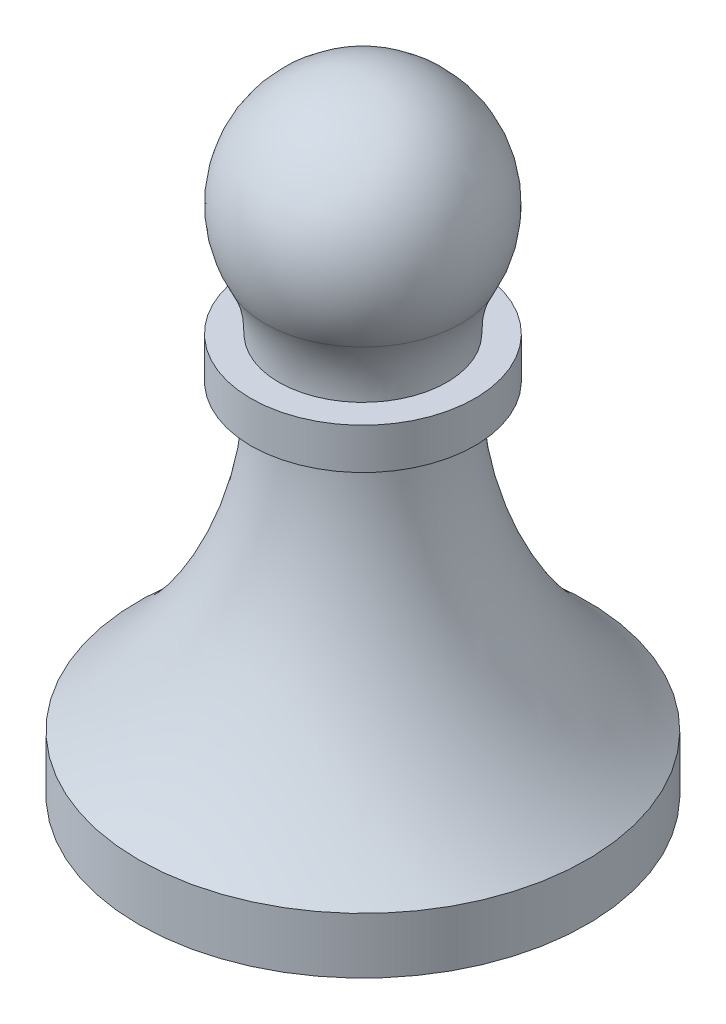
ISO-10303-21;
HEADER;
FILE_DESCRIPTION(('STEP AP214'),'2;1');
FILE_NAME('part.step','',(''),(''),'','','');
FILE_SCHEMA(('AUTOMOTIVE_DESIGN { 1 0 10303 214 1 1 1 1 }'));
ENDSEC;
DATA;
#1=APPLICATION_CONTEXT('core data for automotive mechanical design processes');
#2=APPLICATION_PROTOCOL_DEFINITION('international standard','automotive_design',2000,#1);
#3=PRODUCT_CONTEXT('',#1,'mechanical');
#4=PRODUCT('Part','Part','',(#3));
#5=PRODUCT_RELATED_PRODUCT_CATEGORY('part','',(#4));
#6=PRODUCT_DEFINITION_FORMATION('','',#4);
#7=PRODUCT_DEFINITION_CONTEXT('part definition',#1,'design');
#8=PRODUCT_DEFINITION('design','',#6,#7);
#9=PRODUCT_DEFINITION_SHAPE('','',#8);
#10=(LENGTH_UNIT() NAMED_UNIT(*) SI_UNIT(.MILLI.,.METRE.));
#11=(NAMED_UNIT(*) PLANE_ANGLE_UNIT() SI_UNIT($,.RADIAN.));
#12=(NAMED_UNIT(*) SI_UNIT($,.STERADIAN.) SOLID_ANGLE_UNIT());
#13=UNCERTAINTY_MEASURE_WITH_UNIT(LENGTH_MEASURE(1.E-05),#10,'distance_accuracy_value','');
#14=(GEOMETRIC_REPRESENTATION_CONTEXT(3) GLOBAL_UNCERTAINTY_ASSIGNED_CONTEXT((#13)) GLOBAL_UNIT_ASSIGNED_CONTEXT((#10,
#11,#12)) REPRESENTATION_CONTEXT('',''));
#15=CARTESIAN_POINT('',(0.,0.,0.));
#16=DIRECTION('',(0.,0.,1.));
#17=DIRECTION('',(1.,0.,0.));
#18=AXIS2_PLACEMENT_3D('',#15,#16,#17);
#19=CARTESIAN_POINT('',(0.,21.8150581838445,0.));
#20=DIRECTION('',(0.,1.,0.));
#21=DIRECTION('',(0.,0.,1.));
#22=AXIS2_PLACEMENT_3D('',#19,#20,#21);
#23=CYLINDRICAL_SURFACE('',#22,12.);
#24=CARTESIAN_POINT('',(0.,-19.2,0.));
#25=DIRECTION('',(0.,1.,0.));
#26=DIRECTION('',(0.,0.,1.));
#27=AXIS2_PLACEMENT_3D('',#24,#25,#26);
#28=CIRCLE('',#27,12.);
#29=CARTESIAN_POINT('',(0.,-19.2,12.));
#30=VERTEX_POINT('',#29);
#31=EDGE_CURVE('E63',#30,#30,#28,.T.);
#32=ORIENTED_EDGE('',*,*,#31,.T.);
#33=EDGE_LOOP('',(#32));
#34=FACE_BOUND('',#33,.T.);
#35=CARTESIAN_POINT('',(0.,-16.2,0.));
#36=DIRECTION('',(0.,1.,0.));
#37=DIRECTION('',(0.,0.,1.));
#38=AXIS2_PLACEMENT_3D('',#35,#36,#37);
#39=CIRCLE('',#38,12.);
#40=CARTESIAN_POINT('',(0.,-16.2,12.));
#41=VERTEX_POINT('',#40);
#42=EDGE_CURVE('E10',#41,#41,#39,.T.);
#43=ORIENTED_EDGE('',*,*,#42,.F.);
#44=EDGE_LOOP('',(#43));
#45=FACE_BOUND('',#44,.T.);
#46=ADVANCED_FACE('F38',(#34,#45),#23,.T.);
#47=CARTESIAN_POINT('',(0.,-0.114032224913734,0.));
#48=DIRECTION('',(0.,1.,0.));
#49=DIRECTION('',(0.,0.,1.));
#50=AXIS2_PLACEMENT_3D('',#47,#48,#49);
#51=TOROIDAL_SURFACE('',#50,25.4996903941863,21.);
#52=CARTESIAN_POINT('',(0.,0.,0.));
#53=DIRECTION('',(0.,1.,0.));
#54=DIRECTION('',(0.,0.,1.));
#55=AXIS2_PLACEMENT_3D('',#52,#53,#54);
#56=CIRCLE('',#55,4.5);
#57=CARTESIAN_POINT('',(0.,0.,4.5));
#58=VERTEX_POINT('',#57);
#59=EDGE_CURVE('E44',#58,#58,#56,.T.);
#60=ORIENTED_EDGE('',*,*,#59,.F.);
#61=EDGE_LOOP('',(#60));
#62=FACE_BOUND('',#61,.T.);
#63=ORIENTED_EDGE('',*,*,#42,.T.);
#64=EDGE_LOOP('',(#63));
#65=FACE_BOUND('',#64,.T.);
#66=ADVANCED_FACE('F80',(#62,#65),#51,.F.);
#67=CARTESIAN_POINT('',(0.,0.,0.));
#68=DIRECTION('',(0.,1.,0.));
#69=DIRECTION('',(0.,0.,1.));
#70=AXIS2_PLACEMENT_3D('',#67,#68,#69);
#71=PLANE('',#70);
#72=CARTESIAN_POINT('',(0.,0.,0.));
#73=DIRECTION('',(0.,1.,0.));
#74=DIRECTION('',(0.,0.,1.));
#75=AXIS2_PLACEMENT_3D('',#72,#73,#74);
#76=CIRCLE('',#75,6.);
#77=CARTESIAN_POINT('',(0.,0.,6.));
#78=VERTEX_POINT('',#77);
#79=EDGE_CURVE('E48',#78,#78,#76,.T.);
#80=ORIENTED_EDGE('',*,*,#79,.F.);
#81=EDGE_LOOP('',(#80));
#82=FACE_BOUND('',#81,.T.);
#83=ORIENTED_EDGE('',*,*,#59,.T.);
#84=EDGE_LOOP('',(#83));
#85=FACE_BOUND('',#84,.T.);
#86=ADVANCED_FACE('F84',(#82,#85),#71,.F.);
#87=CARTESIAN_POINT('',(0.,21.8150581838445,0.));
#88=DIRECTION('',(0.,1.,0.));
#89=DIRECTION('',(0.,0.,1.));
#90=AXIS2_PLACEMENT_3D('',#87,#88,#89);
#91=CYLINDRICAL_SURFACE('',#90,6.);
#92=CARTESIAN_POINT('',(0.,2.19483372139822,0.));
#93=DIRECTION('',(0.,1.,0.));
#94=DIRECTION('',(0.,0.,1.));
#95=AXIS2_PLACEMENT_3D('',#92,#93,#94);
#96=CIRCLE('',#95,6.);
#97=CARTESIAN_POINT('',(0.,2.19483372139822,6.));
#98=VERTEX_POINT('',#97);
#99=EDGE_CURVE('E52',#98,#98,#96,.T.);
#100=ORIENTED_EDGE('',*,*,#99,.F.);
#101=EDGE_LOOP('',(#100));
#102=FACE_BOUND('',#101,.T.);
#103=ORIENTED_EDGE('',*,*,#79,.T.);
#104=EDGE_LOOP('',(#103));
#105=FACE_BOUND('',#104,.T.);
#106=ADVANCED_FACE('F89',(#102,#105),#91,.T.);
#107=CARTESIAN_POINT('',(0.,2.19483372139822,0.));
#108=DIRECTION('',(0.,-1.,0.));
#109=DIRECTION('',(0.,0.,-1.));
#110=AXIS2_PLACEMENT_3D('',#107,#108,#109);
#111=PLANE('',#110);
#112=CARTESIAN_POINT('',(0.,2.19483372139822,0.));
#113=DIRECTION('',(0.,1.,0.));
#114=DIRECTION('',(0.,0.,1.));
#115=AXIS2_PLACEMENT_3D('',#112,#113,#114);
#116=CIRCLE('',#115,4.5);
#117=CARTESIAN_POINT('',(0.,2.19483372139822,4.5));
#118=VERTEX_POINT('',#117);
#119=EDGE_CURVE('E57',#118,#118,#116,.T.);
#120=ORIENTED_EDGE('',*,*,#119,.F.);
#121=EDGE_LOOP('',(#120));
#122=FACE_BOUND('',#121,.T.);
#123=ORIENTED_EDGE('',*,*,#99,.T.);
#124=EDGE_LOOP('',(#123));
#125=FACE_BOUND('',#124,.T.);
#126=ADVANCED_FACE('F95',(#122,#125),#111,.F.);
#127=CARTESIAN_POINT('',(0.,2.38018599234987,0.));
#128=DIRECTION('',(0.,1.,0.));
#129=DIRECTION('',(0.,0.,1.));
#130=AXIS2_PLACEMENT_3D('',#127,#128,#129);
#131=TOROIDAL_SURFACE('',#130,10.4971363612689,6.);
#132=ORIENTED_EDGE('',*,*,#119,.T.);
#133=EDGE_LOOP('',(#132));
#134=FACE_BOUND('',#133,.T.);
#135=CARTESIAN_POINT('',(0.,5.28750985687404,0.));
#136=DIRECTION('',(0.,1.,0.));
#137=DIRECTION('',(0.,0.,1.));
#138=AXIS2_PLACEMENT_3D('',#135,#136,#137);
#139=CIRCLE('',#138,5.24856818063443);
#140=CARTESIAN_POINT('',(0.,5.28750985687404,5.24856818063443));
#141=VERTEX_POINT('',#140);
#142=EDGE_CURVE('E60',#141,#141,#139,.T.);
#143=ORIENTED_EDGE('',*,*,#142,.F.);
#144=EDGE_LOOP('',(#143));
#145=FACE_BOUND('',#144,.T.);
#146=ADVANCED_FACE('F76',(#134,#145),#131,.F.);
#147=CARTESIAN_POINT('',(0.,8.19483372139822,0.));
#148=DIRECTION('',(0.,1.,0.));
#149=DIRECTION('',(1.,0.,0.));
#150=AXIS2_PLACEMENT_3D('',#147,#148,#149);
#151=SPHERICAL_SURFACE('',#150,6.);
#152=ORIENTED_EDGE('',*,*,#142,.T.);
#153=EDGE_LOOP('',(#152));
#154=FACE_BOUND('',#153,.T.);
#155=ADVANCED_FACE('F71',(#154),#151,.T.);
#156=CARTESIAN_POINT('',(0.,-19.2,0.));
#157=DIRECTION('',(0.,-1.,0.));
#158=DIRECTION('',(0.,0.,-1.));
#159=AXIS2_PLACEMENT_3D('',#156,#157,#158);
#160=PLANE('',#159);
#161=ORIENTED_EDGE('',*,*,#31,.F.);
#162=EDGE_LOOP('',(#161));
#163=FACE_BOUND('',#162,.T.);
#164=ADVANCED_FACE('F69',(#163),#160,.T.);
#165=CLOSED_SHELL('',(#46,#66,#86,#106,#126,#146,#155,#164));
#166=MANIFOLD_SOLID_BREP('B2',#165);
#167=ADVANCED_BREP_SHAPE_REPRESENTATION('',(#18,#166),#14);
#168=SHAPE_DEFINITION_REPRESENTATION(#9,#167);
ENDSEC;
END-ISO-10303-21;
